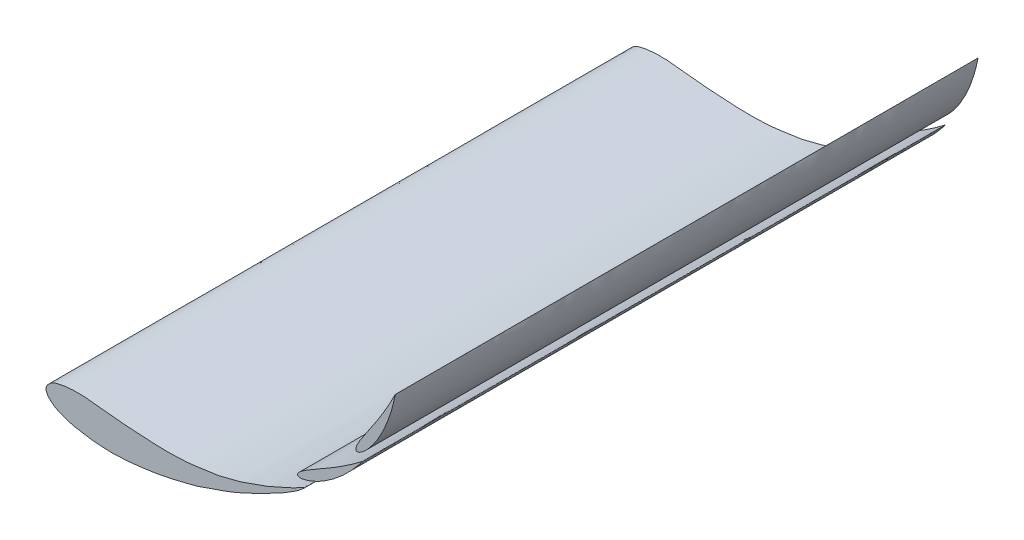
ISO-10303-21;
HEADER;
FILE_DESCRIPTION(('STEP AP214'),'2;1');
FILE_NAME('part.step','',(''),(''),'','','');
FILE_SCHEMA(('AUTOMOTIVE_DESIGN { 1 0 10303 214 1 1 1 1 }'));
ENDSEC;
DATA;
#1=APPLICATION_CONTEXT('core data for automotive mechanical design processes');
#2=APPLICATION_PROTOCOL_DEFINITION('international standard','automotive_design',2000,#1);
#3=PRODUCT_CONTEXT('',#1,'mechanical');
#4=PRODUCT('Part','Part','',(#3));
#5=PRODUCT_RELATED_PRODUCT_CATEGORY('part','',(#4));
#6=PRODUCT_DEFINITION_FORMATION('','',#4);
#7=PRODUCT_DEFINITION_CONTEXT('part definition',#1,'design');
#8=PRODUCT_DEFINITION('design','',#6,#7);
#9=PRODUCT_DEFINITION_SHAPE('','',#8);
#10=(LENGTH_UNIT() NAMED_UNIT(*) SI_UNIT(.MILLI.,.METRE.));
#11=(NAMED_UNIT(*) PLANE_ANGLE_UNIT() SI_UNIT($,.RADIAN.));
#12=(NAMED_UNIT(*) SI_UNIT($,.STERADIAN.) SOLID_ANGLE_UNIT());
#13=UNCERTAINTY_MEASURE_WITH_UNIT(LENGTH_MEASURE(1.E-05),#10,'distance_accuracy_value','');
#14=(GEOMETRIC_REPRESENTATION_CONTEXT(3) GLOBAL_UNCERTAINTY_ASSIGNED_CONTEXT((#13)) GLOBAL_UNIT_ASSIGNED_CONTEXT((#10,
#11,#12)) REPRESENTATION_CONTEXT('',''));
#15=CARTESIAN_POINT('',(0.,0.,0.));
#16=DIRECTION('',(0.,0.,1.));
#17=DIRECTION('',(1.,0.,0.));
#18=AXIS2_PLACEMENT_3D('',#15,#16,#17);
#19=CARTESIAN_POINT('',(539.239928630465,261.033698991669,900.));
#20=CARTESIAN_POINT('',(539.232300477265,261.036691618116,900.));
#21=CARTESIAN_POINT('',(539.071220974005,260.660007341493,900.));
#22=CARTESIAN_POINT('',(538.846984110239,260.294383834939,900.));
#23=CARTESIAN_POINT('',(538.41782519489,259.351147732895,900.));
#24=CARTESIAN_POINT('',(537.812628411893,258.214713722694,900.));
#25=CARTESIAN_POINT('',(537.057592548196,256.693782770289,900.));
#26=CARTESIAN_POINT('',(536.135798945472,254.884204063512,900.));
#27=CARTESIAN_POINT('',(535.044530514407,252.777041307112,900.));
#28=CARTESIAN_POINT('',(533.803223871782,250.395339111111,900.));
#29=CARTESIAN_POINT('',(532.392762892423,247.76418974495,900.));
#30=CARTESIAN_POINT('',(530.864279848168,244.885087006971,900.));
#31=CARTESIAN_POINT('',(529.153510736237,241.81086113186,900.));
#32=CARTESIAN_POINT('',(527.337878897923,238.531830155411,900.));
#33=CARTESIAN_POINT('',(525.37727581775,235.097694517744,900.));
#34=CARTESIAN_POINT('',(523.29728569481,231.522328130302,900.));
#35=CARTESIAN_POINT('',(521.113971493162,227.828708009618,900.));
#36=CARTESIAN_POINT('',(518.816398824944,224.05177134618,900.));
#37=CARTESIAN_POINT('',(516.445296032172,220.199803879306,900.));
#38=CARTESIAN_POINT('',(513.992600523406,216.310761375862,900.));
#39=CARTESIAN_POINT('',(511.474399484813,212.408292536606,900.));
#40=CARTESIAN_POINT('',(508.915559923681,208.510628132491,900.));
#41=CARTESIAN_POINT('',(506.347212062963,204.631542160105,900.));
#42=CARTESIAN_POINT('',(503.766753677036,200.797660601716,900.));
#43=CARTESIAN_POINT('',(501.216247394172,197.019939368675,900.));
#44=CARTESIAN_POINT('',(498.683993850684,193.326930841532,900.));
#45=CARTESIAN_POINT('',(496.230204047151,189.717423878037,900.));
#46=CARTESIAN_POINT('',(493.841272427971,186.226548478348,900.));
#47=CARTESIAN_POINT('',(491.571959726099,182.847140685813,900.));
#48=CARTESIAN_POINT('',(489.413935946165,179.615187713193,900.));
#49=CARTESIAN_POINT('',(487.419075713647,176.516316994619,900.));
#50=CARTESIAN_POINT('',(485.55916011086,173.598156438485,900.));
#51=CARTESIAN_POINT('',(483.903985045361,170.831274842302,900.));
#52=CARTESIAN_POINT('',(482.431961132079,168.262626570955,900.));
#53=CARTESIAN_POINT('',(481.171565958874,165.893066493919,900.));
#54=CARTESIAN_POINT('',(480.139507951726,163.731252801943,900.));
#55=CARTESIAN_POINT('',(479.347102680062,161.786307292206,900.));
#56=CARTESIAN_POINT('',(478.771655483186,160.079971306355,900.));
#57=CARTESIAN_POINT('',(478.456434931632,158.605231473907,900.));
#58=CARTESIAN_POINT('',(478.409787964267,157.366097848513,900.));
#59=CARTESIAN_POINT('',(478.620462538689,156.352412898043,900.));
#60=CARTESIAN_POINT('',(479.152841571248,155.586972786391,900.));
#61=CARTESIAN_POINT('',(479.983174935088,155.165741091178,900.));
#62=CARTESIAN_POINT('',(481.02195066793,155.09533146288,900.));
#63=CARTESIAN_POINT('',(482.243553358147,155.357787716738,900.));
#64=CARTESIAN_POINT('',(483.66785940246,155.909945443868,900.));
#65=CARTESIAN_POINT('',(485.290548480125,156.769181737423,900.));
#66=CARTESIAN_POINT('',(487.094846627291,157.947148925564,900.));
#67=CARTESIAN_POINT('',(489.071128932272,159.421425428565,900.));
#68=CARTESIAN_POINT('',(491.187042136422,161.218256800446,900.));
#69=CARTESIAN_POINT('',(493.443445817489,163.297049949848,900.));
#70=CARTESIAN_POINT('',(495.79889317071,165.682428689869,900.));
#71=CARTESIAN_POINT('',(498.238430572777,168.346851014947,900.));
#72=CARTESIAN_POINT('',(500.713990203479,171.29852632061,900.));
#73=CARTESIAN_POINT('',(503.246383069546,174.485830724644,900.));
#74=CARTESIAN_POINT('',(505.782214613328,177.915869179597,900.));
#75=CARTESIAN_POINT('',(508.301766559538,181.564550427513,900.));
#76=CARTESIAN_POINT('',(510.796103473511,185.398924031937,900.));
#77=CARTESIAN_POINT('',(513.226226138083,189.409999651507,900.));
#78=CARTESIAN_POINT('',(515.605345250479,193.551959475185,900.));
#79=CARTESIAN_POINT('',(517.887801758265,197.813922503783,900.));
#80=CARTESIAN_POINT('',(520.081812496199,202.149664133195,900.));
#81=CARTESIAN_POINT('',(522.16235077034,206.540137267372,900.));
#82=CARTESIAN_POINT('',(524.128203331553,210.948872483309,900.));
#83=CARTESIAN_POINT('',(525.981871124293,215.339633190022,900.));
#84=CARTESIAN_POINT('',(527.68330169927,219.695521508193,900.));
#85=CARTESIAN_POINT('',(529.290584132159,223.958613557572,900.));
#86=CARTESIAN_POINT('',(530.736576406952,228.130098559788,900.));
#87=CARTESIAN_POINT('',(532.065902488644,232.158595227924,900.));
#88=CARTESIAN_POINT('',(533.241787683713,236.02998364931,900.));
#89=CARTESIAN_POINT('',(534.326712468024,239.693930017974,900.));
#90=CARTESIAN_POINT('',(535.248687862695,243.144785769993,900.));
#91=CARTESIAN_POINT('',(536.08837550848,246.341815089341,900.));
#92=CARTESIAN_POINT('',(536.798178993827,249.272795142186,900.));
#93=CARTESIAN_POINT('',(537.394530654545,251.916437039331,900.));
#94=CARTESIAN_POINT('',(537.901637286143,254.248627252391,900.));
#95=CARTESIAN_POINT('',(538.31809228629,256.247821862106,900.));
#96=CARTESIAN_POINT('',(538.654858960903,257.92252350086,900.));
#97=CARTESIAN_POINT('',(538.901431694329,259.189414684493,900.));
#98=CARTESIAN_POINT('',(539.099884417784,260.207139123809,900.));
#99=CARTESIAN_POINT('',(539.147412047066,260.632726817487,900.));
#100=CARTESIAN_POINT('',(539.247452181118,261.030747402198,900.));
#101=CARTESIAN_POINT('',(539.239928630465,261.033698991669,900.));
#102=B_SPLINE_CURVE_WITH_KNOTS('',3,(#19,#20,#21,#22,#23,#24,#25,#26,#27,#28,#29,#30,#31,#32,
#33,#34,#35,#36,#37,#38,#39,#40,#41,#42,#43,#44,#45,#46,#47,#48,#49,#50,#51,#52,#53,#54,#55,#56,
#57,#58,#59,#60,#61,#62,#63,#64,#65,#66,#67,#68,#69,#70,#71,#72,#73,#74,#75,#76,#77,#78,#79,#80,
#81,#82,#83,#84,#85,#86,#87,#88,#89,#90,#91,#92,#93,#94,#95,#96,#97,#98,#99,#100,#101),
.UNSPECIFIED.,.T.,.F.,(4,1,1,1,1,1,1,1,1,1,1,1,1,1,1,1,1,1,1,1,1,1,1,1,1,1,1,1,1,1,1,1,1,1,1,1,
1,1,1,1,1,1,1,1,1,1,1,1,1,1,1,1,1,1,1,1,1,1,1,1,1,1,1,1,1,1,1,1,1,1,1,1,1,1,1,1,1,1,1,1,4),(0.,
0.000781198702112573,0.00307357367497041,0.0069309334445492,0.0122480709359908,
0.0190301017986796,0.0272259908953477,0.0367849913683019,0.0476100368428835,0.059602428736986,
0.0727639055454353,0.0868969022463336,0.102003858815537,0.117938515247847,0.134556032436651,
0.151857594914294,0.169650659189468,0.187837924068789,0.206373782718035,0.225065343567308,
0.24381411241801,0.2625692128739,0.281136751249985,0.299513585913294,0.317505655069097,
0.335105223209855,0.352118008730159,0.368487897674966,0.384166869186213,0.398955230436848,
0.412906353608169,0.425871787121611,0.437810596986798,0.448585291605706,0.458212857068671,
0.466668993153814,0.473884465265206,0.479894258886844,0.48477892366536,0.488742849486563,
0.492166792398752,0.495627983167095,0.499576302920535,0.504486665154988,0.510576140151251,
0.517942731204482,0.526573966899793,0.536524045793585,0.547640110775573,0.560015282697639,
0.573490910748931,0.58803143987488,0.603543532937067,0.619911608546067,0.637089411475324,
0.654944026113226,0.673346427930072,0.692212490967215,0.711460837943305,0.730910148118029,
0.750475101490023,0.770021780153443,0.789460648695538,0.808651173403872,0.827457923224244,
0.845819697952108,0.863558964728616,0.880665566607062,0.896944905994205,0.912322084329315,
0.926717772005598,0.939992516391605,0.952161421002794,0.963060031614414,0.972661788015425,
0.980906352118629,0.987732878676167,0.993080076230874,0.996902185640797,0.999229513638251,1.),.UNSPECIFIED.);
#103=DIRECTION('',(0.,0.,-1.));
#104=VECTOR('',#103,1.);
#105=SURFACE_OF_LINEAR_EXTRUSION('',#102,#104);
#106=CARTESIAN_POINT('',(539.239928630465,261.033698991669,900.));
#107=VERTEX_POINT('',#106);
#108=EDGE_CURVE('E11',#107,#107,#102,.T.);
#109=ORIENTED_EDGE('',*,*,#108,.F.);
#110=EDGE_LOOP('',(#109));
#111=FACE_BOUND('',#110,.T.);
#112=CARTESIAN_POINT('',(539.239928630465,261.033698991669,0.));
#113=CARTESIAN_POINT('',(539.232300477265,261.036691618116,0.));
#114=CARTESIAN_POINT('',(539.071220974005,260.660007341493,0.));
#115=CARTESIAN_POINT('',(538.846984110239,260.294383834939,0.));
#116=CARTESIAN_POINT('',(538.41782519489,259.351147732895,0.));
#117=CARTESIAN_POINT('',(537.812628411893,258.214713722694,0.));
#118=CARTESIAN_POINT('',(537.057592548196,256.693782770289,0.));
#119=CARTESIAN_POINT('',(536.135798945472,254.884204063512,0.));
#120=CARTESIAN_POINT('',(535.044530514407,252.777041307112,0.));
#121=CARTESIAN_POINT('',(533.803223871782,250.395339111111,0.));
#122=CARTESIAN_POINT('',(532.392762892423,247.76418974495,0.));
#123=CARTESIAN_POINT('',(530.864279848168,244.885087006971,0.));
#124=CARTESIAN_POINT('',(529.153510736237,241.81086113186,0.));
#125=CARTESIAN_POINT('',(527.337878897923,238.531830155411,0.));
#126=CARTESIAN_POINT('',(525.37727581775,235.097694517744,0.));
#127=CARTESIAN_POINT('',(523.29728569481,231.522328130302,0.));
#128=CARTESIAN_POINT('',(521.113971493162,227.828708009618,0.));
#129=CARTESIAN_POINT('',(518.816398824944,224.05177134618,0.));
#130=CARTESIAN_POINT('',(516.445296032172,220.199803879306,0.));
#131=CARTESIAN_POINT('',(513.992600523406,216.310761375862,0.));
#132=CARTESIAN_POINT('',(511.474399484813,212.408292536606,0.));
#133=CARTESIAN_POINT('',(508.915559923681,208.510628132491,0.));
#134=CARTESIAN_POINT('',(506.347212062963,204.631542160105,0.));
#135=CARTESIAN_POINT('',(503.766753677036,200.797660601716,0.));
#136=CARTESIAN_POINT('',(501.216247394172,197.019939368675,0.));
#137=CARTESIAN_POINT('',(498.683993850684,193.326930841532,0.));
#138=CARTESIAN_POINT('',(496.230204047151,189.717423878037,0.));
#139=CARTESIAN_POINT('',(493.841272427971,186.226548478348,0.));
#140=CARTESIAN_POINT('',(491.571959726099,182.847140685813,0.));
#141=CARTESIAN_POINT('',(489.413935946165,179.615187713193,0.));
#142=CARTESIAN_POINT('',(487.419075713647,176.516316994619,0.));
#143=CARTESIAN_POINT('',(485.55916011086,173.598156438485,0.));
#144=CARTESIAN_POINT('',(483.903985045361,170.831274842302,0.));
#145=CARTESIAN_POINT('',(482.431961132079,168.262626570955,0.));
#146=CARTESIAN_POINT('',(481.171565958874,165.893066493919,0.));
#147=CARTESIAN_POINT('',(480.139507951726,163.731252801943,0.));
#148=CARTESIAN_POINT('',(479.347102680062,161.786307292206,0.));
#149=CARTESIAN_POINT('',(478.771655483186,160.079971306355,0.));
#150=CARTESIAN_POINT('',(478.456434931632,158.605231473907,0.));
#151=CARTESIAN_POINT('',(478.409787964267,157.366097848513,0.));
#152=CARTESIAN_POINT('',(478.620462538689,156.352412898043,0.));
#153=CARTESIAN_POINT('',(479.152841571248,155.586972786391,0.));
#154=CARTESIAN_POINT('',(479.983174935088,155.165741091178,0.));
#155=CARTESIAN_POINT('',(481.02195066793,155.09533146288,0.));
#156=CARTESIAN_POINT('',(482.243553358147,155.357787716738,0.));
#157=CARTESIAN_POINT('',(483.66785940246,155.909945443868,0.));
#158=CARTESIAN_POINT('',(485.290548480125,156.769181737423,0.));
#159=CARTESIAN_POINT('',(487.094846627291,157.947148925564,0.));
#160=CARTESIAN_POINT('',(489.071128932272,159.421425428565,0.));
#161=CARTESIAN_POINT('',(491.187042136422,161.218256800446,0.));
#162=CARTESIAN_POINT('',(493.443445817489,163.297049949848,0.));
#163=CARTESIAN_POINT('',(495.79889317071,165.682428689869,0.));
#164=CARTESIAN_POINT('',(498.238430572777,168.346851014947,0.));
#165=CARTESIAN_POINT('',(500.713990203479,171.29852632061,0.));
#166=CARTESIAN_POINT('',(503.246383069546,174.485830724644,0.));
#167=CARTESIAN_POINT('',(505.782214613328,177.915869179597,0.));
#168=CARTESIAN_POINT('',(508.301766559538,181.564550427513,0.));
#169=CARTESIAN_POINT('',(510.796103473511,185.398924031937,0.));
#170=CARTESIAN_POINT('',(513.226226138083,189.409999651507,0.));
#171=CARTESIAN_POINT('',(515.605345250479,193.551959475185,0.));
#172=CARTESIAN_POINT('',(517.887801758265,197.813922503783,0.));
#173=CARTESIAN_POINT('',(520.081812496199,202.149664133195,0.));
#174=CARTESIAN_POINT('',(522.16235077034,206.540137267372,0.));
#175=CARTESIAN_POINT('',(524.128203331553,210.948872483309,0.));
#176=CARTESIAN_POINT('',(525.981871124293,215.339633190022,0.));
#177=CARTESIAN_POINT('',(527.68330169927,219.695521508193,0.));
#178=CARTESIAN_POINT('',(529.290584132159,223.958613557572,0.));
#179=CARTESIAN_POINT('',(530.736576406952,228.130098559788,0.));
#180=CARTESIAN_POINT('',(532.065902488644,232.158595227924,0.));
#181=CARTESIAN_POINT('',(533.241787683713,236.02998364931,0.));
#182=CARTESIAN_POINT('',(534.326712468024,239.693930017974,0.));
#183=CARTESIAN_POINT('',(535.248687862695,243.144785769993,0.));
#184=CARTESIAN_POINT('',(536.08837550848,246.341815089341,0.));
#185=CARTESIAN_POINT('',(536.798178993827,249.272795142186,0.));
#186=CARTESIAN_POINT('',(537.394530654545,251.916437039331,0.));
#187=CARTESIAN_POINT('',(537.901637286143,254.248627252391,0.));
#188=CARTESIAN_POINT('',(538.31809228629,256.247821862106,0.));
#189=CARTESIAN_POINT('',(538.654858960903,257.92252350086,0.));
#190=CARTESIAN_POINT('',(538.901431694329,259.189414684493,0.));
#191=CARTESIAN_POINT('',(539.099884417784,260.207139123809,0.));
#192=CARTESIAN_POINT('',(539.147412047066,260.632726817487,0.));
#193=CARTESIAN_POINT('',(539.247452181118,261.030747402198,0.));
#194=CARTESIAN_POINT('',(539.239928630465,261.033698991669,0.));
#195=B_SPLINE_CURVE_WITH_KNOTS('',3,(#112,#113,#114,#115,#116,#117,#118,#119,#120,#121,#122,
#123,#124,#125,#126,#127,#128,#129,#130,#131,#132,#133,#134,#135,#136,#137,#138,#139,#140,#141,
#142,#143,#144,#145,#146,#147,#148,#149,#150,#151,#152,#153,#154,#155,#156,#157,#158,#159,#160,
#161,#162,#163,#164,#165,#166,#167,#168,#169,#170,#171,#172,#173,#174,#175,#176,#177,#178,#179,
#180,#181,#182,#183,#184,#185,#186,#187,#188,#189,#190,#191,#192,#193,#194),.UNSPECIFIED.,.T.,
.F.,(4,1,1,1,1,1,1,1,1,1,1,1,1,1,1,1,1,1,1,1,1,1,1,1,1,1,1,1,1,1,1,1,1,1,1,1,1,1,1,1,1,1,1,1,1,
1,1,1,1,1,1,1,1,1,1,1,1,1,1,1,1,1,1,1,1,1,1,1,1,1,1,1,1,1,1,1,1,1,1,1,4),(0.,
0.000781198702112573,0.00307357367497041,0.0069309334445492,0.0122480709359908,
0.0190301017986796,0.0272259908953477,0.0367849913683019,0.0476100368428835,0.059602428736986,
0.0727639055454353,0.0868969022463336,0.102003858815537,0.117938515247847,0.134556032436651,
0.151857594914294,0.169650659189468,0.187837924068789,0.206373782718035,0.225065343567308,
0.24381411241801,0.2625692128739,0.281136751249985,0.299513585913294,0.317505655069097,
0.335105223209855,0.352118008730159,0.368487897674966,0.384166869186213,0.398955230436848,
0.412906353608169,0.425871787121611,0.437810596986798,0.448585291605706,0.458212857068671,
0.466668993153814,0.473884465265206,0.479894258886844,0.48477892366536,0.488742849486563,
0.492166792398752,0.495627983167095,0.499576302920535,0.504486665154988,0.510576140151251,
0.517942731204482,0.526573966899793,0.536524045793585,0.547640110775573,0.560015282697639,
0.573490910748931,0.58803143987488,0.603543532937067,0.619911608546067,0.637089411475324,
0.654944026113226,0.673346427930072,0.692212490967215,0.711460837943305,0.730910148118029,
0.750475101490023,0.770021780153443,0.789460648695538,0.808651173403872,0.827457923224244,
0.845819697952108,0.863558964728616,0.880665566607062,0.896944905994205,0.912322084329315,
0.926717772005598,0.939992516391605,0.952161421002794,0.963060031614414,0.972661788015425,
0.980906352118629,0.987732878676167,0.993080076230874,0.996902185640797,0.999229513638251,1.),.UNSPECIFIED.);
#196=CARTESIAN_POINT('',(539.239928630465,261.033698991669,0.));
#197=VERTEX_POINT('',#196);
#198=EDGE_CURVE('E44',#197,#197,#195,.T.);
#199=ORIENTED_EDGE('',*,*,#198,.T.);
#200=EDGE_LOOP('',(#199));
#201=FACE_BOUND('',#200,.T.);
#202=ADVANCED_FACE('F40',(#111,#201),#105,.F.);
#203=CARTESIAN_POINT('',(481.041814225848,155.149096590296,900.));
#204=DIRECTION('',(0.,0.,-1.));
#205=DIRECTION('',(-1.,0.,0.));
#206=AXIS2_PLACEMENT_3D('',#203,#204,#205);
#207=PLANE('',#206);
#208=ORIENTED_EDGE('',*,*,#108,.T.);
#209=EDGE_LOOP('',(#208));
#210=FACE_BOUND('',#209,.T.);
#211=ADVANCED_FACE('F63',(#210),#207,.F.);
#212=CARTESIAN_POINT('',(481.041814225848,155.149096590296,0.));
#213=DIRECTION('',(0.,0.,-1.));
#214=DIRECTION('',(-1.,0.,0.));
#215=AXIS2_PLACEMENT_3D('',#212,#213,#214);
#216=PLANE('',#215);
#217=ORIENTED_EDGE('',*,*,#198,.F.);
#218=EDGE_LOOP('',(#217));
#219=FACE_BOUND('',#218,.T.);
#220=ADVANCED_FACE('F61',(#219),#216,.T.);
#221=CLOSED_SHELL('',(#202,#211,#220));
#222=MANIFOLD_SOLID_BREP('B2',#221);
#223=CARTESIAN_POINT('',(488.739928630465,146.27662582917,900.));
#224=CARTESIAN_POINT('',(488.734390863346,146.282664355547,900.));
#225=CARTESIAN_POINT('',(488.424255517426,146.01504699691,900.));
#226=CARTESIAN_POINT('',(488.062245709904,145.785104349675,900.));
#227=CARTESIAN_POINT('',(487.262468981896,145.12631220198,900.));
#228=CARTESIAN_POINT('',(486.219708703151,144.371292999427,900.));
#229=CARTESIAN_POINT('',(484.873478648553,143.336701677104,900.));
#230=CARTESIAN_POINT('',(483.250678892477,142.116067573056,900.));
#231=CARTESIAN_POINT('',(481.344943870688,140.702556836281,900.));
#232=CARTESIAN_POINT('',(479.183854282281,139.108333078033,900.));
#233=CARTESIAN_POINT('',(476.761259361215,137.364331889066,900.));
#234=CARTESIAN_POINT('',(474.123745832161,135.449437463721,900.));
#235=CARTESIAN_POINT('',(471.236790601668,133.439330858047,900.));
#236=CARTESIAN_POINT('',(468.165688429437,131.291310186243,900.));
#237=CARTESIAN_POINT('',(464.896239769335,129.06763584633,900.));
#238=CARTESIAN_POINT('',(461.457519682352,126.769533616792,900.));
#239=CARTESIAN_POINT('',(457.874048725567,124.410588122819,900.));
#240=CARTESIAN_POINT('',(454.151349506776,122.026984887844,900.));
#241=CARTESIAN_POINT('',(450.329646268581,119.608278586708,900.));
#242=CARTESIAN_POINT('',(446.418367049558,117.192104930028,900.));
#243=CARTESIAN_POINT('',(442.442349173081,114.79264125896,900.));
#244=CARTESIAN_POINT('',(438.431937029852,112.415341988165,900.));
#245=CARTESIAN_POINT('',(434.421143630124,110.058907294122,900.));
#246=CARTESIAN_POINT('',(430.419325782454,107.748397440423,900.));
#247=CARTESIAN_POINT('',(426.469079037841,105.475179612489,900.));
#248=CARTESIAN_POINT('',(422.572434596525,103.27004002656,900.));
#249=CARTESIAN_POINT('',(418.782946313853,101.10544566783,900.));
#250=CARTESIAN_POINT('',(415.10382204835,99.0189284501041,900.));
#251=CARTESIAN_POINT('',(411.581105321317,96.9800019124718,900.));
#252=CARTESIAN_POINT('',(408.223119367779,95.0246509160597,900.));
#253=CARTESIAN_POINT('',(405.07014913214,93.1171813131887,900.));
#254=CARTESIAN_POINT('',(402.117764879436,91.3127698144926,900.));
#255=CARTESIAN_POINT('',(399.415735866924,89.5543243863948,900.));
#256=CARTESIAN_POINT('',(396.965291651818,87.8935049791158,900.));
#257=CARTESIAN_POINT('',(394.792388290663,86.3185719469364,900.));
#258=CARTESIAN_POINT('',(392.915837214648,84.8299642374554,900.));
#259=CARTESIAN_POINT('',(391.349809227271,83.4309058217597,900.));
#260=CARTESIAN_POINT('',(390.083467317447,82.1508939663859,900.));
#261=CARTESIAN_POINT('',(389.152598068423,80.9646249134886,900.));
#262=CARTESIAN_POINT('',(388.566460536368,79.8720347457727,900.));
#263=CARTESIAN_POINT('',(388.310486080436,78.8689412199548,900.));
#264=CARTESIAN_POINT('',(388.452520239117,77.9475440549797,900.));
#265=CARTESIAN_POINT('',(389.013376817318,77.2044757693509,900.));
#266=CARTESIAN_POINT('',(389.915554573103,76.6849914760721,900.));
#267=CARTESIAN_POINT('',(391.128157445966,76.3842121175746,900.));
#268=CARTESIAN_POINT('',(392.650081725337,76.2546345074329,900.));
#269=CARTESIAN_POINT('',(394.485078729723,76.3137654991859,900.));
#270=CARTESIAN_POINT('',(396.623198675156,76.5794392805699,900.));
#271=CARTESIAN_POINT('',(399.045948072087,77.0357425228106,900.));
#272=CARTESIAN_POINT('',(401.735792151443,77.7204606178033,900.));
#273=CARTESIAN_POINT('',(404.675674285304,78.5967524353365,900.));
#274=CARTESIAN_POINT('',(407.839178955957,79.7049405517023,900.));
#275=CARTESIAN_POINT('',(411.200777120761,81.0268525143301,900.));
#276=CARTESIAN_POINT('',(414.720896471866,82.5909742988022,900.));
#277=CARTESIAN_POINT('',(418.395557373598,84.3417933318362,900.));
#278=CARTESIAN_POINT('',(422.179917585336,86.30914303918,900.));
#279=CARTESIAN_POINT('',(426.045683707428,88.480043342402,900.));
#280=CARTESIAN_POINT('',(429.9703572421,90.8288203227971,900.));
#281=CARTESIAN_POINT('',(433.914957703485,93.3645269385314,900.));
#282=CARTESIAN_POINT('',(437.871228384027,96.0402041494393,900.));
#283=CARTESIAN_POINT('',(441.793376071028,98.866131635475,900.));
#284=CARTESIAN_POINT('',(445.668479548687,101.797178284391,900.));
#285=CARTESIAN_POINT('',(449.46569244888,104.827226535812,900.));
#286=CARTESIAN_POINT('',(453.167907326534,107.924049830986,900.));
#287=CARTESIAN_POINT('',(456.761455350462,111.053999458349,900.));
#288=CARTESIAN_POINT('',(460.202936902475,114.219487850543,900.));
#289=CARTESIAN_POINT('',(463.519091154153,117.342970547263,900.));
#290=CARTESIAN_POINT('',(466.650128692124,120.455005021754,900.));
#291=CARTESIAN_POINT('',(469.613566920658,123.489837803891,900.));
#292=CARTESIAN_POINT('',(472.37017063644,126.450937080651,900.));
#293=CARTESIAN_POINT('',(474.95395729083,129.265647602717,900.));
#294=CARTESIAN_POINT('',(477.297780382239,131.960513477739,900.));
#295=CARTESIAN_POINT('',(479.456204478104,134.463515761446,900.));
#296=CARTESIAN_POINT('',(481.381106749274,136.784579703903,900.));
#297=CARTESIAN_POINT('',(483.077897662024,138.897364919162,900.));
#298=CARTESIAN_POINT('',(484.557730653776,140.769579134179,900.));
#299=CARTESIAN_POINT('',(485.809879978603,142.382487859808,900.));
#300=CARTESIAN_POINT('',(486.847928070509,143.738913605865,900.));
#301=CARTESIAN_POINT('',(487.625844433844,144.768628828198,900.));
#302=CARTESIAN_POINT('',(488.251100258334,145.595659419026,900.));
#303=CARTESIAN_POINT('',(488.480713959173,145.957078055332,900.));
#304=CARTESIAN_POINT('',(488.745390459866,146.270670107271,900.));
#305=CARTESIAN_POINT('',(488.739928630465,146.27662582917,900.));
#306=B_SPLINE_CURVE_WITH_KNOTS('',3,(#223,#224,#225,#226,#227,#228,#229,#230,#231,#232,#233,
#234,#235,#236,#237,#238,#239,#240,#241,#242,#243,#244,#245,#246,#247,#248,#249,#250,#251,#252,
#253,#254,#255,#256,#257,#258,#259,#260,#261,#262,#263,#264,#265,#266,#267,#268,#269,#270,#271,
#272,#273,#274,#275,#276,#277,#278,#279,#280,#281,#282,#283,#284,#285,#286,#287,#288,#289,#290,
#291,#292,#293,#294,#295,#296,#297,#298,#299,#300,#301,#302,#303,#304,#305),.UNSPECIFIED.,.T.,
.F.,(4,1,1,1,1,1,1,1,1,1,1,1,1,1,1,1,1,1,1,1,1,1,1,1,1,1,1,1,1,1,1,1,1,1,1,1,1,1,1,1,1,1,1,1,1,
1,1,1,1,1,1,1,1,1,1,1,1,1,1,1,1,1,1,1,1,1,1,1,1,1,1,1,1,1,1,1,1,1,1,1,4),(0.,
0.000781198702112573,0.00307357367497041,0.0069309334445492,0.0122480709359908,
0.0190301017986796,0.0272259908953477,0.0367849913683019,0.0476100368428835,0.059602428736986,
0.0727639055454353,0.0868969022463336,0.102003858815537,0.117938515247847,0.134556032436651,
0.151857594914294,0.169650659189468,0.187837924068789,0.206373782718035,0.225065343567308,
0.24381411241801,0.2625692128739,0.281136751249985,0.299513585913294,0.317505655069097,
0.335105223209855,0.352118008730159,0.368487897674966,0.384166869186213,0.398955230436848,
0.412906353608169,0.425871787121611,0.437810596986798,0.448585291605706,0.458212857068671,
0.466668993153814,0.473884465265206,0.479894258886844,0.48477892366536,0.488742849486563,
0.492166792398752,0.495627983167095,0.499576302920535,0.504486665154988,0.510576140151251,
0.517942731204482,0.526573966899793,0.536524045793585,0.547640110775573,0.560015282697639,
0.573490910748931,0.58803143987488,0.603543532937067,0.619911608546067,0.637089411475324,
0.654944026113226,0.673346427930072,0.692212490967215,0.711460837943305,0.730910148118029,
0.750475101490023,0.770021780153443,0.789460648695538,0.808651173403872,0.827457923224244,
0.845819697952108,0.863558964728616,0.880665566607062,0.896944905994205,0.912322084329315,
0.926717772005598,0.939992516391605,0.952161421002794,0.963060031614414,0.972661788015425,
0.980906352118629,0.987732878676167,0.993080076230874,0.996902185640797,0.999229513638251,1.),.UNSPECIFIED.);
#307=DIRECTION('',(0.,0.,-1.));
#308=VECTOR('',#307,1.);
#309=SURFACE_OF_LINEAR_EXTRUSION('',#306,#308);
#310=CARTESIAN_POINT('',(488.739928630465,146.27662582917,900.));
#311=VERTEX_POINT('',#310);
#312=EDGE_CURVE('E39',#311,#311,#306,.T.);
#313=ORIENTED_EDGE('',*,*,#312,.F.);
#314=EDGE_LOOP('',(#313));
#315=FACE_BOUND('',#314,.T.);
#316=CARTESIAN_POINT('',(488.739928630465,146.27662582917,0.));
#317=CARTESIAN_POINT('',(488.734390863346,146.282664355547,0.));
#318=CARTESIAN_POINT('',(488.424255517426,146.01504699691,0.));
#319=CARTESIAN_POINT('',(488.062245709904,145.785104349675,0.));
#320=CARTESIAN_POINT('',(487.262468981896,145.12631220198,0.));
#321=CARTESIAN_POINT('',(486.219708703151,144.371292999427,0.));
#322=CARTESIAN_POINT('',(484.873478648553,143.336701677104,0.));
#323=CARTESIAN_POINT('',(483.250678892477,142.116067573056,0.));
#324=CARTESIAN_POINT('',(481.344943870688,140.702556836281,0.));
#325=CARTESIAN_POINT('',(479.183854282281,139.108333078033,0.));
#326=CARTESIAN_POINT('',(476.761259361215,137.364331889066,0.));
#327=CARTESIAN_POINT('',(474.123745832161,135.449437463721,0.));
#328=CARTESIAN_POINT('',(471.236790601668,133.439330858047,0.));
#329=CARTESIAN_POINT('',(468.165688429437,131.291310186243,0.));
#330=CARTESIAN_POINT('',(464.896239769335,129.06763584633,0.));
#331=CARTESIAN_POINT('',(461.457519682352,126.769533616792,0.));
#332=CARTESIAN_POINT('',(457.874048725567,124.410588122819,0.));
#333=CARTESIAN_POINT('',(454.151349506776,122.026984887844,0.));
#334=CARTESIAN_POINT('',(450.329646268581,119.608278586708,0.));
#335=CARTESIAN_POINT('',(446.418367049558,117.192104930028,0.));
#336=CARTESIAN_POINT('',(442.442349173081,114.79264125896,0.));
#337=CARTESIAN_POINT('',(438.431937029852,112.415341988165,0.));
#338=CARTESIAN_POINT('',(434.421143630124,110.058907294122,0.));
#339=CARTESIAN_POINT('',(430.419325782454,107.748397440423,0.));
#340=CARTESIAN_POINT('',(426.469079037841,105.475179612489,0.));
#341=CARTESIAN_POINT('',(422.572434596525,103.27004002656,0.));
#342=CARTESIAN_POINT('',(418.782946313853,101.10544566783,0.));
#343=CARTESIAN_POINT('',(415.10382204835,99.0189284501041,0.));
#344=CARTESIAN_POINT('',(411.581105321317,96.9800019124718,0.));
#345=CARTESIAN_POINT('',(408.223119367779,95.0246509160597,0.));
#346=CARTESIAN_POINT('',(405.07014913214,93.1171813131887,0.));
#347=CARTESIAN_POINT('',(402.117764879436,91.3127698144926,0.));
#348=CARTESIAN_POINT('',(399.415735866924,89.5543243863948,0.));
#349=CARTESIAN_POINT('',(396.965291651818,87.8935049791158,0.));
#350=CARTESIAN_POINT('',(394.792388290663,86.3185719469364,0.));
#351=CARTESIAN_POINT('',(392.915837214648,84.8299642374554,0.));
#352=CARTESIAN_POINT('',(391.349809227271,83.4309058217597,0.));
#353=CARTESIAN_POINT('',(390.083467317447,82.1508939663859,0.));
#354=CARTESIAN_POINT('',(389.152598068423,80.9646249134886,0.));
#355=CARTESIAN_POINT('',(388.566460536368,79.8720347457727,0.));
#356=CARTESIAN_POINT('',(388.310486080436,78.8689412199548,0.));
#357=CARTESIAN_POINT('',(388.452520239117,77.9475440549797,0.));
#358=CARTESIAN_POINT('',(389.013376817318,77.2044757693509,0.));
#359=CARTESIAN_POINT('',(389.915554573103,76.6849914760721,0.));
#360=CARTESIAN_POINT('',(391.128157445966,76.3842121175746,0.));
#361=CARTESIAN_POINT('',(392.650081725337,76.2546345074329,0.));
#362=CARTESIAN_POINT('',(394.485078729723,76.3137654991859,0.));
#363=CARTESIAN_POINT('',(396.623198675156,76.5794392805699,0.));
#364=CARTESIAN_POINT('',(399.045948072087,77.0357425228106,0.));
#365=CARTESIAN_POINT('',(401.735792151443,77.7204606178033,0.));
#366=CARTESIAN_POINT('',(404.675674285304,78.5967524353365,0.));
#367=CARTESIAN_POINT('',(407.839178955957,79.7049405517023,0.));
#368=CARTESIAN_POINT('',(411.200777120761,81.0268525143301,0.));
#369=CARTESIAN_POINT('',(414.720896471866,82.5909742988022,0.));
#370=CARTESIAN_POINT('',(418.395557373598,84.3417933318362,0.));
#371=CARTESIAN_POINT('',(422.179917585336,86.30914303918,0.));
#372=CARTESIAN_POINT('',(426.045683707428,88.480043342402,0.));
#373=CARTESIAN_POINT('',(429.9703572421,90.8288203227971,0.));
#374=CARTESIAN_POINT('',(433.914957703485,93.3645269385314,0.));
#375=CARTESIAN_POINT('',(437.871228384027,96.0402041494393,0.));
#376=CARTESIAN_POINT('',(441.793376071028,98.866131635475,0.));
#377=CARTESIAN_POINT('',(445.668479548687,101.797178284391,0.));
#378=CARTESIAN_POINT('',(449.46569244888,104.827226535812,0.));
#379=CARTESIAN_POINT('',(453.167907326534,107.924049830986,0.));
#380=CARTESIAN_POINT('',(456.761455350462,111.053999458349,0.));
#381=CARTESIAN_POINT('',(460.202936902475,114.219487850543,0.));
#382=CARTESIAN_POINT('',(463.519091154153,117.342970547263,0.));
#383=CARTESIAN_POINT('',(466.650128692124,120.455005021754,0.));
#384=CARTESIAN_POINT('',(469.613566920658,123.489837803891,0.));
#385=CARTESIAN_POINT('',(472.37017063644,126.450937080651,0.));
#386=CARTESIAN_POINT('',(474.95395729083,129.265647602717,0.));
#387=CARTESIAN_POINT('',(477.297780382239,131.960513477739,0.));
#388=CARTESIAN_POINT('',(479.456204478104,134.463515761446,0.));
#389=CARTESIAN_POINT('',(481.381106749274,136.784579703903,0.));
#390=CARTESIAN_POINT('',(483.077897662024,138.897364919162,0.));
#391=CARTESIAN_POINT('',(484.557730653776,140.769579134179,0.));
#392=CARTESIAN_POINT('',(485.809879978603,142.382487859808,0.));
#393=CARTESIAN_POINT('',(486.847928070509,143.738913605865,0.));
#394=CARTESIAN_POINT('',(487.625844433844,144.768628828198,0.));
#395=CARTESIAN_POINT('',(488.251100258334,145.595659419026,0.));
#396=CARTESIAN_POINT('',(488.480713959173,145.957078055332,0.));
#397=CARTESIAN_POINT('',(488.745390459866,146.270670107271,0.));
#398=CARTESIAN_POINT('',(488.739928630465,146.27662582917,0.));
#399=B_SPLINE_CURVE_WITH_KNOTS('',3,(#316,#317,#318,#319,#320,#321,#322,#323,#324,#325,#326,
#327,#328,#329,#330,#331,#332,#333,#334,#335,#336,#337,#338,#339,#340,#341,#342,#343,#344,#345,
#346,#347,#348,#349,#350,#351,#352,#353,#354,#355,#356,#357,#358,#359,#360,#361,#362,#363,#364,
#365,#366,#367,#368,#369,#370,#371,#372,#373,#374,#375,#376,#377,#378,#379,#380,#381,#382,#383,
#384,#385,#386,#387,#388,#389,#390,#391,#392,#393,#394,#395,#396,#397,#398),.UNSPECIFIED.,.T.,
.F.,(4,1,1,1,1,1,1,1,1,1,1,1,1,1,1,1,1,1,1,1,1,1,1,1,1,1,1,1,1,1,1,1,1,1,1,1,1,1,1,1,1,1,1,1,1,
1,1,1,1,1,1,1,1,1,1,1,1,1,1,1,1,1,1,1,1,1,1,1,1,1,1,1,1,1,1,1,1,1,1,1,4),(0.,
0.000781198702112573,0.00307357367497041,0.0069309334445492,0.0122480709359908,
0.0190301017986796,0.0272259908953477,0.0367849913683019,0.0476100368428835,0.059602428736986,
0.0727639055454353,0.0868969022463336,0.102003858815537,0.117938515247847,0.134556032436651,
0.151857594914294,0.169650659189468,0.187837924068789,0.206373782718035,0.225065343567308,
0.24381411241801,0.2625692128739,0.281136751249985,0.299513585913294,0.317505655069097,
0.335105223209855,0.352118008730159,0.368487897674966,0.384166869186213,0.398955230436848,
0.412906353608169,0.425871787121611,0.437810596986798,0.448585291605706,0.458212857068671,
0.466668993153814,0.473884465265206,0.479894258886844,0.48477892366536,0.488742849486563,
0.492166792398752,0.495627983167095,0.499576302920535,0.504486665154988,0.510576140151251,
0.517942731204482,0.526573966899793,0.536524045793585,0.547640110775573,0.560015282697639,
0.573490910748931,0.58803143987488,0.603543532937067,0.619911608546067,0.637089411475324,
0.654944026113226,0.673346427930072,0.692212490967215,0.711460837943305,0.730910148118029,
0.750475101490023,0.770021780153443,0.789460648695538,0.808651173403872,0.827457923224244,
0.845819697952108,0.863558964728616,0.880665566607062,0.896944905994205,0.912322084329315,
0.926717772005598,0.939992516391605,0.952161421002794,0.963060031614414,0.972661788015425,
0.980906352118629,0.987732878676167,0.993080076230874,0.996902185640797,0.999229513638251,1.),.UNSPECIFIED.);
#400=CARTESIAN_POINT('',(488.739928630465,146.27662582917,0.));
#401=VERTEX_POINT('',#400);
#402=EDGE_CURVE('E103',#401,#401,#399,.T.);
#403=ORIENTED_EDGE('',*,*,#402,.T.);
#404=EDGE_LOOP('',(#403));
#405=FACE_BOUND('',#404,.T.);
#406=ADVANCED_FACE('F99',(#315,#405),#309,.F.);
#407=CARTESIAN_POINT('',(389.957011441149,76.7245629225494,900.));
#408=DIRECTION('',(0.,0.,-1.));
#409=DIRECTION('',(-1.,0.,0.));
#410=AXIS2_PLACEMENT_3D('',#407,#408,#409);
#411=PLANE('',#410);
#412=ORIENTED_EDGE('',*,*,#312,.T.);
#413=EDGE_LOOP('',(#412));
#414=FACE_BOUND('',#413,.T.);
#415=ADVANCED_FACE('F122',(#414),#411,.F.);
#416=CARTESIAN_POINT('',(389.957011441149,76.7245629225494,0.));
#417=DIRECTION('',(0.,0.,-1.));
#418=DIRECTION('',(-1.,0.,0.));
#419=AXIS2_PLACEMENT_3D('',#416,#417,#418);
#420=PLANE('',#419);
#421=ORIENTED_EDGE('',*,*,#402,.F.);
#422=EDGE_LOOP('',(#421));
#423=FACE_BOUND('',#422,.T.);
#424=ADVANCED_FACE('F120',(#423),#420,.T.);
#425=CLOSED_SHELL('',(#406,#415,#424));
#426=MANIFOLD_SOLID_BREP('B6',#425);
#427=CARTESIAN_POINT('',(0.,0.,900.));
#428=CARTESIAN_POINT('',(-0.659755649534352,-5.69970346447195,900.));
#429=CARTESIAN_POINT('',(8.01754851646626,-15.4805620245211,900.));
#430=CARTESIAN_POINT('',(19.5511575064031,-21.7240156458156,900.));
#431=CARTESIAN_POINT('',(30.0167453527629,-25.3022151649407,900.));
#432=CARTESIAN_POINT('',(39.859962541203,-28.8642232004001,900.));
#433=CARTESIAN_POINT('',(50.0403992751716,-30.6629334177748,900.));
#434=CARTESIAN_POINT('',(60.0706038059943,-32.257702330634,900.));
#435=CARTESIAN_POINT('',(70.0138771616113,-34.2176743219382,900.));
#436=CARTESIAN_POINT('',(80.1009729334425,-34.5599919498497,900.));
#437=CARTESIAN_POINT('',(90.0930664566918,-35.3651943800456,900.));
#438=CARTESIAN_POINT('',(100.111969814218,-35.9529432689535,900.));
#439=CARTESIAN_POINT('',(110.128217778092,-35.5072166783891,900.));
#440=CARTESIAN_POINT('',(120.153157744339,-35.2100035461739,900.));
#441=CARTESIAN_POINT('',(130.150331682679,-34.2298001156874,900.));
#442=CARTESIAN_POINT('',(140.189993261339,-33.4101629224064,900.));
#443=CARTESIAN_POINT('',(150.178235203826,-31.9134060067946,900.));
#444=CARTESIAN_POINT('',(160.170449626995,-30.371338733884,900.));
#445=CARTESIAN_POINT('',(170.24078975382,-29.1636408413946,900.));
#446=CARTESIAN_POINT('',(180.208316099343,-27.1510300870197,900.));
#447=CARTESIAN_POINT('',(190.263801281087,-25.3061202228447,900.));
#448=CARTESIAN_POINT('',(200.239152099225,-22.872450661827,900.));
#449=CARTESIAN_POINT('',(210.244577583204,-20.42911101244,900.));
#450=CARTESIAN_POINT('',(220.232934245068,-17.8950889660576,900.));
#451=CARTESIAN_POINT('',(230.381125348033,-15.7054384372757,900.));
#452=CARTESIAN_POINT('',(240.351948948634,-12.3911448315056,900.));
#453=CARTESIAN_POINT('',(253.551193016702,-7.3696388159463,900.));
#454=CARTESIAN_POINT('',(266.947574476479,-2.80654931289765,900.));
#455=CARTESIAN_POINT('',(280.43686580893,1.6366434359854,900.));
#456=CARTESIAN_POINT('',(290.361357741597,5.81951676919574,900.));
#457=CARTESIAN_POINT('',(300.440735094308,10.0322277588439,900.));
#458=CARTESIAN_POINT('',(310.304777653156,14.8840532024557,900.));
#459=CARTESIAN_POINT('',(323.821431635989,20.8841901662365,900.));
#460=CARTESIAN_POINT('',(337.302282020239,27.2498334172722,900.));
#461=CARTESIAN_POINT('',(350.274680502791,34.8502357968631,900.));
#462=CARTESIAN_POINT('',(364.03744766416,41.2006794352578,900.));
#463=CARTESIAN_POINT('',(378.073354269359,50.4318783740266,900.));
#464=CARTESIAN_POINT('',(389.268655411455,56.9916715462661,900.));
#465=CARTESIAN_POINT('',(404.933124868403,70.6704285846182,900.));
#466=CARTESIAN_POINT('',(388.893146180842,60.897261378664,900.));
#467=CARTESIAN_POINT('',(380.961681236814,56.8333399476447,900.));
#468=CARTESIAN_POINT('',(370.316551330721,52.1732057433164,900.));
#469=CARTESIAN_POINT('',(360.413556577633,47.7491379036596,900.));
#470=CARTESIAN_POINT('',(350.469658047208,43.0754424922102,900.));
#471=CARTESIAN_POINT('',(340.496714174023,38.8332000315388,900.));
#472=CARTESIAN_POINT('',(330.405194537334,35.2609561445067,900.));
#473=CARTESIAN_POINT('',(320.349773518739,31.8494384880981,900.));
#474=CARTESIAN_POINT('',(310.358327920782,28.3259174797758,900.));
#475=CARTESIAN_POINT('',(300.486931551091,24.6621693976878,900.));
#476=CARTESIAN_POINT('',(290.321799776934,22.3006392833529,900.));
#477=CARTESIAN_POINT('',(280.290360105233,19.761885569755,900.));
#478=CARTESIAN_POINT('',(270.426731207175,16.7650176794778,900.));
#479=CARTESIAN_POINT('',(260.335958512035,15.0613412241291,900.));
#480=CARTESIAN_POINT('',(250.276874185969,13.9587581077887,900.));
#481=CARTESIAN_POINT('',(240.266180312828,12.5782549819245,900.));
#482=CARTESIAN_POINT('',(230.27868889205,11.0678610600858,900.));
#483=CARTESIAN_POINT('',(220.286700520217,9.69636414326911,900.));
#484=CARTESIAN_POINT('',(210.243264635394,9.24041396620224,900.));
#485=CARTESIAN_POINT('',(200.228739037299,9.03450530535798,900.));
#486=CARTESIAN_POINT('',(190.217040671643,8.27916506576322,900.));
#487=CARTESIAN_POINT('',(180.212460888764,9.16236085071367,900.));
#488=CARTESIAN_POINT('',(170.184221627906,8.72850477285026,900.));
#489=CARTESIAN_POINT('',(160.186505008344,9.5821979670044,900.));
#490=CARTESIAN_POINT('',(150.167787888029,9.98919689617312,900.));
#491=CARTESIAN_POINT('',(140.163470123313,10.7007469437441,900.));
#492=CARTESIAN_POINT('',(130.145958280993,11.2144509981874,900.));
#493=CARTESIAN_POINT('',(120.121382337903,11.8408818851352,900.));
#494=CARTESIAN_POINT('',(110.132801048257,12.9697374893053,900.));
#495=CARTESIAN_POINT('',(100.114836916456,13.8501366053537,900.));
#496=CARTESIAN_POINT('',(90.0937700569623,14.7158577740332,900.));
#497=CARTESIAN_POINT('',(80.0796337239116,15.8426606070156,900.));
#498=CARTESIAN_POINT('',(56.9177469779037,18.8474988678268,900.));
#499=CARTESIAN_POINT('',(32.3828319517727,18.9633804841757,900.));
#500=CARTESIAN_POINT('',(8.41761672973582,12.262874152014,900.));
#501=CARTESIAN_POINT('',(0.546057517246994,4.71745247661061,900.));
#502=CARTESIAN_POINT('',(0.,0.,900.));
#503=B_SPLINE_CURVE_WITH_KNOTS('',3,(#427,#428,#429,#430,#431,#432,#433,#434,#435,#436,#437,
#438,#439,#440,#441,#442,#443,#444,#445,#446,#447,#448,#449,#450,#451,#452,#453,#454,#455,#456,
#457,#458,#459,#460,#461,#462,#463,#464,#465,#466,#467,#468,#469,#470,#471,#472,#473,#474,#475,
#476,#477,#478,#479,#480,#481,#482,#483,#484,#485,#486,#487,#488,#489,#490,#491,#492,#493,#494,
#495,#496,#497,#498,#499,#500,#501,#502),.UNSPECIFIED.,.T.,.F.,(4,1,1,1,1,1,1,1,1,1,1,1,1,1,1,1,
1,1,1,1,1,1,1,1,1,1,1,1,1,1,1,1,1,1,1,1,1,1,1,1,1,1,1,1,1,1,1,1,1,1,1,1,1,1,1,1,1,1,1,1,1,1,1,1,
1,1,1,1,1,1,1,1,1,4),(0.,0.022023735636867,0.0356221525782026,0.0481968883083359,
0.0605845364750125,0.0726021094425411,0.0845454218720098,0.0964786124092299,0.108283815986083,
0.12008962651633,0.131879307189533,0.143660653581064,0.155449489942431,0.16726854553366,
0.179100010051904,0.190991158312832,0.202896850425652,0.214787998686579,0.226765537933231,
0.238768470472458,0.250863752346246,0.262991876188348,0.27512000003045,0.287234564079755,
0.29960069176003,0.312149730022287,0.33708178690326,0.349542489666608,0.362249466169008,
0.375072168086278,0.388091418609311,0.401030286180521,0.427260863052806,0.440708925658888,
0.453891579164357,0.481343844219682,0.495528158800433,0.510184265145305,0.522427915659948,
0.535732545914393,0.548643085947115,0.561553625979837,0.574510663130568,0.587286643293851,
0.599816471626972,0.612271302515005,0.624763181658669,0.637218012546701,0.649381243526042,
0.661544474505382,0.673750263176041,0.685718324654125,0.697586387627207,0.709471546843514,
0.721375261083615,0.733243324056697,0.745039761263716,0.756824218518373,0.768610894873778,
0.780397571229183,0.792175284405609,0.803971721612629,0.815766061098423,0.827566920339846,
0.839363385323629,0.851169099473206,0.863005976200646,0.874833225182902,0.886659585953375,
0.898509640557797,0.910371211794422,0.96929541231833,0.981771696216834,1.),.UNSPECIFIED.);
#504=DIRECTION('',(0.,0.,-1.));
#505=VECTOR('',#504,1.);
#506=SURFACE_OF_LINEAR_EXTRUSION('',#503,#505);
#507=CARTESIAN_POINT('',(0.,0.,900.));
#508=VERTEX_POINT('',#507);
#509=EDGE_CURVE('E98',#508,#508,#503,.T.);
#510=ORIENTED_EDGE('',*,*,#509,.F.);
#511=EDGE_LOOP('',(#510));
#512=FACE_BOUND('',#511,.T.);
#513=CARTESIAN_POINT('',(0.,0.,0.));
#514=CARTESIAN_POINT('',(-0.659755649534352,-5.69970346447195,0.));
#515=CARTESIAN_POINT('',(8.01754851646626,-15.4805620245211,0.));
#516=CARTESIAN_POINT('',(19.5511575064031,-21.7240156458156,0.));
#517=CARTESIAN_POINT('',(30.0167453527629,-25.3022151649407,0.));
#518=CARTESIAN_POINT('',(39.859962541203,-28.8642232004001,0.));
#519=CARTESIAN_POINT('',(50.0403992751716,-30.6629334177748,0.));
#520=CARTESIAN_POINT('',(60.0706038059943,-32.257702330634,0.));
#521=CARTESIAN_POINT('',(70.0138771616113,-34.2176743219382,0.));
#522=CARTESIAN_POINT('',(80.1009729334425,-34.5599919498497,0.));
#523=CARTESIAN_POINT('',(90.0930664566918,-35.3651943800456,0.));
#524=CARTESIAN_POINT('',(100.111969814218,-35.9529432689535,0.));
#525=CARTESIAN_POINT('',(110.128217778092,-35.5072166783891,0.));
#526=CARTESIAN_POINT('',(120.153157744339,-35.2100035461739,0.));
#527=CARTESIAN_POINT('',(130.150331682679,-34.2298001156874,0.));
#528=CARTESIAN_POINT('',(140.189993261339,-33.4101629224064,0.));
#529=CARTESIAN_POINT('',(150.178235203826,-31.9134060067946,0.));
#530=CARTESIAN_POINT('',(160.170449626995,-30.371338733884,0.));
#531=CARTESIAN_POINT('',(170.24078975382,-29.1636408413946,0.));
#532=CARTESIAN_POINT('',(180.208316099343,-27.1510300870197,0.));
#533=CARTESIAN_POINT('',(190.263801281087,-25.3061202228447,0.));
#534=CARTESIAN_POINT('',(200.239152099225,-22.872450661827,0.));
#535=CARTESIAN_POINT('',(210.244577583204,-20.42911101244,0.));
#536=CARTESIAN_POINT('',(220.232934245068,-17.8950889660576,0.));
#537=CARTESIAN_POINT('',(230.381125348033,-15.7054384372757,0.));
#538=CARTESIAN_POINT('',(240.351948948634,-12.3911448315056,0.));
#539=CARTESIAN_POINT('',(253.551193016702,-7.3696388159463,0.));
#540=CARTESIAN_POINT('',(266.947574476479,-2.80654931289765,0.));
#541=CARTESIAN_POINT('',(280.43686580893,1.6366434359854,0.));
#542=CARTESIAN_POINT('',(290.361357741597,5.81951676919574,0.));
#543=CARTESIAN_POINT('',(300.440735094308,10.0322277588439,0.));
#544=CARTESIAN_POINT('',(310.304777653156,14.8840532024557,0.));
#545=CARTESIAN_POINT('',(323.821431635989,20.8841901662365,0.));
#546=CARTESIAN_POINT('',(337.302282020239,27.2498334172722,0.));
#547=CARTESIAN_POINT('',(350.274680502791,34.8502357968631,0.));
#548=CARTESIAN_POINT('',(364.03744766416,41.2006794352578,0.));
#549=CARTESIAN_POINT('',(378.073354269359,50.4318783740266,0.));
#550=CARTESIAN_POINT('',(389.268655411455,56.9916715462661,0.));
#551=CARTESIAN_POINT('',(404.933124868403,70.6704285846182,0.));
#552=CARTESIAN_POINT('',(388.893146180842,60.897261378664,0.));
#553=CARTESIAN_POINT('',(380.961681236814,56.8333399476447,0.));
#554=CARTESIAN_POINT('',(370.316551330721,52.1732057433164,0.));
#555=CARTESIAN_POINT('',(360.413556577633,47.7491379036596,0.));
#556=CARTESIAN_POINT('',(350.469658047208,43.0754424922102,0.));
#557=CARTESIAN_POINT('',(340.496714174023,38.8332000315388,0.));
#558=CARTESIAN_POINT('',(330.405194537334,35.2609561445067,0.));
#559=CARTESIAN_POINT('',(320.349773518739,31.8494384880981,0.));
#560=CARTESIAN_POINT('',(310.358327920782,28.3259174797758,0.));
#561=CARTESIAN_POINT('',(300.486931551091,24.6621693976878,0.));
#562=CARTESIAN_POINT('',(290.321799776934,22.3006392833529,0.));
#563=CARTESIAN_POINT('',(280.290360105233,19.761885569755,0.));
#564=CARTESIAN_POINT('',(270.426731207175,16.7650176794778,0.));
#565=CARTESIAN_POINT('',(260.335958512035,15.0613412241291,0.));
#566=CARTESIAN_POINT('',(250.276874185969,13.9587581077887,0.));
#567=CARTESIAN_POINT('',(240.266180312828,12.5782549819245,0.));
#568=CARTESIAN_POINT('',(230.27868889205,11.0678610600858,0.));
#569=CARTESIAN_POINT('',(220.286700520217,9.69636414326911,0.));
#570=CARTESIAN_POINT('',(210.243264635394,9.24041396620224,0.));
#571=CARTESIAN_POINT('',(200.228739037299,9.03450530535798,0.));
#572=CARTESIAN_POINT('',(190.217040671643,8.27916506576322,0.));
#573=CARTESIAN_POINT('',(180.212460888764,9.16236085071367,0.));
#574=CARTESIAN_POINT('',(170.184221627906,8.72850477285026,0.));
#575=CARTESIAN_POINT('',(160.186505008344,9.5821979670044,0.));
#576=CARTESIAN_POINT('',(150.167787888029,9.98919689617312,0.));
#577=CARTESIAN_POINT('',(140.163470123313,10.7007469437441,0.));
#578=CARTESIAN_POINT('',(130.145958280993,11.2144509981874,0.));
#579=CARTESIAN_POINT('',(120.121382337903,11.8408818851352,0.));
#580=CARTESIAN_POINT('',(110.132801048257,12.9697374893053,0.));
#581=CARTESIAN_POINT('',(100.114836916456,13.8501366053537,0.));
#582=CARTESIAN_POINT('',(90.0937700569623,14.7158577740332,0.));
#583=CARTESIAN_POINT('',(80.0796337239116,15.8426606070156,0.));
#584=CARTESIAN_POINT('',(56.9177469779037,18.8474988678268,0.));
#585=CARTESIAN_POINT('',(32.3828319517727,18.9633804841757,0.));
#586=CARTESIAN_POINT('',(8.41761672973582,12.262874152014,0.));
#587=CARTESIAN_POINT('',(0.546057517246994,4.71745247661061,0.));
#588=CARTESIAN_POINT('',(0.,0.,0.));
#589=B_SPLINE_CURVE_WITH_KNOTS('',3,(#513,#514,#515,#516,#517,#518,#519,#520,#521,#522,#523,
#524,#525,#526,#527,#528,#529,#530,#531,#532,#533,#534,#535,#536,#537,#538,#539,#540,#541,#542,
#543,#544,#545,#546,#547,#548,#549,#550,#551,#552,#553,#554,#555,#556,#557,#558,#559,#560,#561,
#562,#563,#564,#565,#566,#567,#568,#569,#570,#571,#572,#573,#574,#575,#576,#577,#578,#579,#580,
#581,#582,#583,#584,#585,#586,#587,#588),.UNSPECIFIED.,.T.,.F.,(4,1,1,1,1,1,1,1,1,1,1,1,1,1,1,1,
1,1,1,1,1,1,1,1,1,1,1,1,1,1,1,1,1,1,1,1,1,1,1,1,1,1,1,1,1,1,1,1,1,1,1,1,1,1,1,1,1,1,1,1,1,1,1,1,
1,1,1,1,1,1,1,1,1,4),(0.,0.022023735636867,0.0356221525782026,0.0481968883083359,
0.0605845364750125,0.0726021094425411,0.0845454218720098,0.0964786124092299,0.108283815986083,
0.12008962651633,0.131879307189533,0.143660653581064,0.155449489942431,0.16726854553366,
0.179100010051904,0.190991158312832,0.202896850425652,0.214787998686579,0.226765537933231,
0.238768470472458,0.250863752346246,0.262991876188348,0.27512000003045,0.287234564079755,
0.29960069176003,0.312149730022287,0.33708178690326,0.349542489666608,0.362249466169008,
0.375072168086278,0.388091418609311,0.401030286180521,0.427260863052806,0.440708925658888,
0.453891579164357,0.481343844219682,0.495528158800433,0.510184265145305,0.522427915659948,
0.535732545914393,0.548643085947115,0.561553625979837,0.574510663130568,0.587286643293851,
0.599816471626972,0.612271302515005,0.624763181658669,0.637218012546701,0.649381243526042,
0.661544474505382,0.673750263176041,0.685718324654125,0.697586387627207,0.709471546843514,
0.721375261083615,0.733243324056697,0.745039761263716,0.756824218518373,0.768610894873778,
0.780397571229183,0.792175284405609,0.803971721612629,0.815766061098423,0.827566920339846,
0.839363385323629,0.851169099473206,0.863005976200646,0.874833225182902,0.886659585953375,
0.898509640557797,0.910371211794422,0.96929541231833,0.981771696216834,1.),.UNSPECIFIED.);
#590=CARTESIAN_POINT('',(0.,0.,0.));
#591=VERTEX_POINT('',#590);
#592=EDGE_CURVE('E155',#591,#591,#589,.T.);
#593=ORIENTED_EDGE('',*,*,#592,.T.);
#594=EDGE_LOOP('',(#593));
#595=FACE_BOUND('',#594,.T.);
#596=ADVANCED_FACE('F151',(#512,#595),#506,.F.);
#597=CARTESIAN_POINT('',(394.482667374492,61.7113953010148,900.));
#598=DIRECTION('',(0.,0.,-1.));
#599=DIRECTION('',(-1.,0.,0.));
#600=AXIS2_PLACEMENT_3D('',#597,#598,#599);
#601=PLANE('',#600);
#602=ORIENTED_EDGE('',*,*,#509,.T.);
#603=EDGE_LOOP('',(#602));
#604=FACE_BOUND('',#603,.T.);
#605=ADVANCED_FACE('F174',(#604),#601,.F.);
#606=CARTESIAN_POINT('',(394.482667374492,61.7113953010148,0.));
#607=DIRECTION('',(0.,0.,-1.));
#608=DIRECTION('',(-1.,0.,0.));
#609=AXIS2_PLACEMENT_3D('',#606,#607,#608);
#610=PLANE('',#609);
#611=ORIENTED_EDGE('',*,*,#592,.F.);
#612=EDGE_LOOP('',(#611));
#613=FACE_BOUND('',#612,.T.);
#614=ADVANCED_FACE('F172',(#613),#610,.T.);
#615=CLOSED_SHELL('',(#596,#605,#614));
#616=MANIFOLD_SOLID_BREP('B34',#615);
#617=ADVANCED_BREP_SHAPE_REPRESENTATION('',(#18,#222,#426,#616),#14);
#618=SHAPE_DEFINITION_REPRESENTATION(#9,#617);
ENDSEC;
END-ISO-10303-21;
